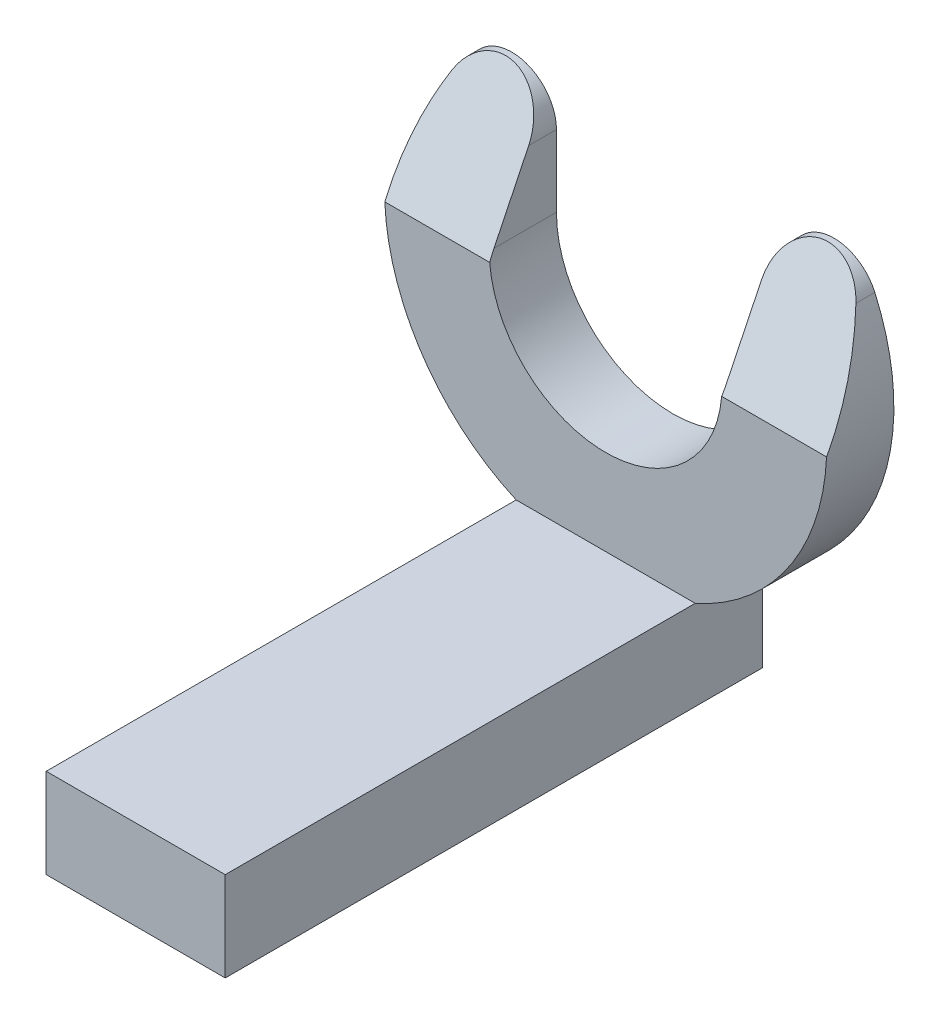
ISO-10303-21;
HEADER;
FILE_DESCRIPTION(('STEP AP214'),'2;1');
FILE_NAME('part.step','',(''),(''),'','','');
FILE_SCHEMA(('AUTOMOTIVE_DESIGN { 1 0 10303 214 1 1 1 1 }'));
ENDSEC;
DATA;
#1=APPLICATION_CONTEXT('core data for automotive mechanical design processes');
#2=APPLICATION_PROTOCOL_DEFINITION('international standard','automotive_design',2000,#1);
#3=PRODUCT_CONTEXT('',#1,'mechanical');
#4=PRODUCT('Part','Part','',(#3));
#5=PRODUCT_RELATED_PRODUCT_CATEGORY('part','',(#4));
#6=PRODUCT_DEFINITION_FORMATION('','',#4);
#7=PRODUCT_DEFINITION_CONTEXT('part definition',#1,'design');
#8=PRODUCT_DEFINITION('design','',#6,#7);
#9=PRODUCT_DEFINITION_SHAPE('','',#8);
#10=(LENGTH_UNIT() NAMED_UNIT(*) SI_UNIT(.MILLI.,.METRE.));
#11=(NAMED_UNIT(*) PLANE_ANGLE_UNIT() SI_UNIT($,.RADIAN.));
#12=(NAMED_UNIT(*) SI_UNIT($,.STERADIAN.) SOLID_ANGLE_UNIT());
#13=UNCERTAINTY_MEASURE_WITH_UNIT(LENGTH_MEASURE(1.E-05),#10,'distance_accuracy_value','');
#14=(GEOMETRIC_REPRESENTATION_CONTEXT(3) GLOBAL_UNCERTAINTY_ASSIGNED_CONTEXT((#13)) GLOBAL_UNIT_ASSIGNED_CONTEXT((#10,
#11,#12)) REPRESENTATION_CONTEXT('',''));
#15=CARTESIAN_POINT('',(0.,0.,0.));
#16=DIRECTION('',(0.,0.,1.));
#17=DIRECTION('',(1.,0.,0.));
#18=AXIS2_PLACEMENT_3D('',#15,#16,#17);
#19=CARTESIAN_POINT('',(-2.,2.,12.));
#20=DIRECTION('',(0.,-1.,0.));
#21=DIRECTION('',(0.,0.,-1.));
#22=AXIS2_PLACEMENT_3D('',#19,#20,#21);
#23=PLANE('',#22);
#24=DIRECTION('',(1.,0.,0.));
#25=VECTOR('',#24,1.);
#26=CARTESIAN_POINT('',(-2.,2.,1.5));
#27=LINE('',#26,#25);
#28=CARTESIAN_POINT('',(-2.,2.,1.5));
#29=VERTEX_POINT('',#28);
#30=CARTESIAN_POINT('',(2.,2.,1.5));
#31=VERTEX_POINT('',#30);
#32=EDGE_CURVE('E40',#29,#31,#27,.T.);
#33=ORIENTED_EDGE('',*,*,#32,.F.);
#34=DIRECTION('',(0.,0.,-1.));
#35=VECTOR('',#34,1.);
#36=CARTESIAN_POINT('',(-2.,2.,12.));
#37=LINE('',#36,#35);
#38=CARTESIAN_POINT('',(-2.,2.,12.));
#39=VERTEX_POINT('',#38);
#40=EDGE_CURVE('E204',#39,#29,#37,.T.);
#41=ORIENTED_EDGE('',*,*,#40,.F.);
#42=DIRECTION('',(-1.,0.,0.));
#43=VECTOR('',#42,1.);
#44=CARTESIAN_POINT('',(-2.,2.,12.));
#45=LINE('',#44,#43);
#46=CARTESIAN_POINT('',(2.,2.,12.));
#47=VERTEX_POINT('',#46);
#48=EDGE_CURVE('E202',#47,#39,#45,.T.);
#49=ORIENTED_EDGE('',*,*,#48,.F.);
#50=DIRECTION('',(0.,0.,-1.));
#51=VECTOR('',#50,1.);
#52=CARTESIAN_POINT('',(2.,2.,12.));
#53=LINE('',#52,#51);
#54=EDGE_CURVE('E212',#47,#31,#53,.T.);
#55=ORIENTED_EDGE('',*,*,#54,.T.);
#56=EDGE_LOOP('',(#33,#41,#49,#55));
#57=FACE_BOUND('',#56,.T.);
#58=ADVANCED_FACE('F32',(#57),#23,.F.);
#59=CARTESIAN_POINT('',(-2.,0.,12.));
#60=DIRECTION('',(1.,0.,0.));
#61=DIRECTION('',(0.,0.,-1.));
#62=AXIS2_PLACEMENT_3D('',#59,#60,#61);
#63=PLANE('',#62);
#64=DIRECTION('',(0.,-1.,0.));
#65=VECTOR('',#64,1.);
#66=CARTESIAN_POINT('',(-2.,0.,0.));
#67=LINE('',#66,#65);
#68=CARTESIAN_POINT('',(-2.,2.,0.));
#69=VERTEX_POINT('',#68);
#70=CARTESIAN_POINT('',(-2.,0.,0.));
#71=VERTEX_POINT('',#70);
#72=EDGE_CURVE('E193',#69,#71,#67,.T.);
#73=ORIENTED_EDGE('',*,*,#72,.T.);
#74=DIRECTION('',(0.,0.,-1.));
#75=VECTOR('',#74,1.);
#76=CARTESIAN_POINT('',(-2.,0.,12.));
#77=LINE('',#76,#75);
#78=CARTESIAN_POINT('',(-2.,0.,12.));
#79=VERTEX_POINT('',#78);
#80=EDGE_CURVE('E218',#79,#71,#77,.T.);
#81=ORIENTED_EDGE('',*,*,#80,.F.);
#82=DIRECTION('',(0.,-1.,0.));
#83=VECTOR('',#82,1.);
#84=CARTESIAN_POINT('',(-2.,0.,12.));
#85=LINE('',#84,#83);
#86=EDGE_CURVE('E194',#39,#79,#85,.T.);
#87=ORIENTED_EDGE('',*,*,#86,.F.);
#88=ORIENTED_EDGE('',*,*,#40,.T.);
#89=DIRECTION('',(0.,0.,-1.));
#90=VECTOR('',#89,1.);
#91=CARTESIAN_POINT('',(-2.,2.,1.5));
#92=LINE('',#91,#90);
#93=EDGE_CURVE('E151',#29,#69,#92,.T.);
#94=ORIENTED_EDGE('',*,*,#93,.T.);
#95=EDGE_LOOP('',(#73,#81,#87,#88,#94));
#96=FACE_BOUND('',#95,.T.);
#97=ADVANCED_FACE('F34',(#96),#63,.F.);
#98=CARTESIAN_POINT('',(-2.,0.,12.));
#99=DIRECTION('',(0.,1.,0.));
#100=DIRECTION('',(0.,0.,1.));
#101=AXIS2_PLACEMENT_3D('',#98,#99,#100);
#102=PLANE('',#101);
#103=DIRECTION('',(1.,0.,0.));
#104=VECTOR('',#103,1.);
#105=CARTESIAN_POINT('',(-2.,0.,0.));
#106=LINE('',#105,#104);
#107=CARTESIAN_POINT('',(2.,0.,0.));
#108=VERTEX_POINT('',#107);
#109=EDGE_CURVE('E207',#71,#108,#106,.T.);
#110=ORIENTED_EDGE('',*,*,#109,.T.);
#111=DIRECTION('',(0.,0.,-1.));
#112=VECTOR('',#111,1.);
#113=CARTESIAN_POINT('',(2.,0.,12.));
#114=LINE('',#113,#112);
#115=CARTESIAN_POINT('',(2.,0.,12.));
#116=VERTEX_POINT('',#115);
#117=EDGE_CURVE('E215',#116,#108,#114,.T.);
#118=ORIENTED_EDGE('',*,*,#117,.F.);
#119=DIRECTION('',(1.,0.,0.));
#120=VECTOR('',#119,1.);
#121=CARTESIAN_POINT('',(-2.,0.,12.));
#122=LINE('',#121,#120);
#123=EDGE_CURVE('E197',#79,#116,#122,.T.);
#124=ORIENTED_EDGE('',*,*,#123,.F.);
#125=ORIENTED_EDGE('',*,*,#80,.T.);
#126=EDGE_LOOP('',(#110,#118,#124,#125));
#127=FACE_BOUND('',#126,.T.);
#128=ADVANCED_FACE('F268',(#127),#102,.F.);
#129=CARTESIAN_POINT('',(2.,0.,12.));
#130=DIRECTION('',(-1.,0.,0.));
#131=DIRECTION('',(0.,0.,1.));
#132=AXIS2_PLACEMENT_3D('',#129,#130,#131);
#133=PLANE('',#132);
#134=DIRECTION('',(0.,1.,0.));
#135=VECTOR('',#134,1.);
#136=CARTESIAN_POINT('',(2.,0.,0.));
#137=LINE('',#136,#135);
#138=CARTESIAN_POINT('',(2.,2.,0.));
#139=VERTEX_POINT('',#138);
#140=EDGE_CURVE('E198',#108,#139,#137,.T.);
#141=ORIENTED_EDGE('',*,*,#140,.T.);
#142=DIRECTION('',(0.,0.,-1.));
#143=VECTOR('',#142,1.);
#144=CARTESIAN_POINT('',(2.,2.,1.5));
#145=LINE('',#144,#143);
#146=EDGE_CURVE('E180',#139,#31,#145,.F.);
#147=ORIENTED_EDGE('',*,*,#146,.T.);
#148=ORIENTED_EDGE('',*,*,#54,.F.);
#149=DIRECTION('',(0.,1.,0.));
#150=VECTOR('',#149,1.);
#151=CARTESIAN_POINT('',(2.,0.,12.));
#152=LINE('',#151,#150);
#153=EDGE_CURVE('E200',#116,#47,#152,.T.);
#154=ORIENTED_EDGE('',*,*,#153,.F.);
#155=ORIENTED_EDGE('',*,*,#117,.T.);
#156=EDGE_LOOP('',(#141,#147,#148,#154,#155));
#157=FACE_BOUND('',#156,.T.);
#158=ADVANCED_FACE('F232',(#157),#133,.F.);
#159=CARTESIAN_POINT('',(0.,0.,12.));
#160=DIRECTION('',(0.,0.,-1.));
#161=DIRECTION('',(-1.,0.,0.));
#162=AXIS2_PLACEMENT_3D('',#159,#160,#161);
#163=PLANE('',#162);
#164=ORIENTED_EDGE('',*,*,#86,.T.);
#165=ORIENTED_EDGE('',*,*,#123,.T.);
#166=ORIENTED_EDGE('',*,*,#153,.T.);
#167=ORIENTED_EDGE('',*,*,#48,.T.);
#168=EDGE_LOOP('',(#164,#165,#166,#167));
#169=FACE_BOUND('',#168,.T.);
#170=ADVANCED_FACE('F228',(#169),#163,.F.);
#171=CARTESIAN_POINT('',(0.,0.,0.));
#172=DIRECTION('',(0.,0.,-1.));
#173=DIRECTION('',(-1.,0.,0.));
#174=AXIS2_PLACEMENT_3D('',#171,#172,#173);
#175=PLANE('',#174);
#176=ORIENTED_EDGE('',*,*,#72,.F.);
#177=CARTESIAN_POINT('',(0.,6.51654775221352,0.));
#178=DIRECTION('',(0.,0.,-1.));
#179=DIRECTION('',(-1.,0.,0.));
#180=AXIS2_PLACEMENT_3D('',#177,#178,#179);
#181=CIRCLE('',#180,4.939555);
#182=CARTESIAN_POINT('',(-4.51380879312511,8.52272166718984,0.));
#183=VERTEX_POINT('',#182);
#184=EDGE_CURVE('E175',#69,#183,#181,.T.);
#185=ORIENTED_EDGE('',*,*,#184,.T.);
#186=CARTESIAN_POINT('',(-3.6,8.11657700132899,0.));
#187=DIRECTION('',(0.,0.,-1.));
#188=DIRECTION('',(-1.,0.,0.));
#189=AXIS2_PLACEMENT_3D('',#186,#187,#188);
#190=CIRCLE('',#189,1.);
#191=CARTESIAN_POINT('',(-2.6,8.11657700132899,0.));
#192=VERTEX_POINT('',#191);
#193=EDGE_CURVE('E159',#183,#192,#190,.T.);
#194=ORIENTED_EDGE('',*,*,#193,.T.);
#195=DIRECTION('',(0.,-1.,0.));
#196=VECTOR('',#195,1.);
#197=CARTESIAN_POINT('',(-2.6,6.51654775221352,0.));
#198=LINE('',#197,#196);
#199=CARTESIAN_POINT('',(-2.6,6.51654775221352,0.));
#200=VERTEX_POINT('',#199);
#201=EDGE_CURVE('E162',#192,#200,#198,.T.);
#202=ORIENTED_EDGE('',*,*,#201,.T.);
#203=CARTESIAN_POINT('',(0.,6.51654775221352,0.));
#204=DIRECTION('',(0.,0.,1.));
#205=DIRECTION('',(-1.,0.,0.));
#206=AXIS2_PLACEMENT_3D('',#203,#204,#205);
#207=CIRCLE('',#206,2.6);
#208=CARTESIAN_POINT('',(2.6,6.51654775221352,0.));
#209=VERTEX_POINT('',#208);
#210=EDGE_CURVE('E166',#200,#209,#207,.T.);
#211=ORIENTED_EDGE('',*,*,#210,.T.);
#212=DIRECTION('',(0.,1.,0.));
#213=VECTOR('',#212,1.);
#214=CARTESIAN_POINT('',(2.6,6.51654775221352,0.));
#215=LINE('',#214,#213);
#216=CARTESIAN_POINT('',(2.6,8.11657700132899,0.));
#217=VERTEX_POINT('',#216);
#218=EDGE_CURVE('E169',#209,#217,#215,.T.);
#219=ORIENTED_EDGE('',*,*,#218,.T.);
#220=CARTESIAN_POINT('',(3.6,8.11657700132899,0.));
#221=DIRECTION('',(0.,0.,-1.));
#222=DIRECTION('',(-1.,0.,0.));
#223=AXIS2_PLACEMENT_3D('',#220,#221,#222);
#224=CIRCLE('',#223,1.);
#225=CARTESIAN_POINT('',(4.51380879312511,8.52272166718984,0.));
#226=VERTEX_POINT('',#225);
#227=EDGE_CURVE('E172',#217,#226,#224,.T.);
#228=ORIENTED_EDGE('',*,*,#227,.T.);
#229=EDGE_CURVE('E155',#226,#139,#181,.T.);
#230=ORIENTED_EDGE('',*,*,#229,.T.);
#231=ORIENTED_EDGE('',*,*,#140,.F.);
#232=ORIENTED_EDGE('',*,*,#109,.F.);
#233=EDGE_LOOP('',(#176,#185,#194,#202,#211,#219,#228,#230,#231,#232));
#234=FACE_BOUND('',#233,.T.);
#235=ADVANCED_FACE('F241',(#234),#175,.T.);
#236=CARTESIAN_POINT('',(-3.6,8.11657700132899,1.5));
#237=DIRECTION('',(0.,0.,-1.));
#238=DIRECTION('',(-1.,0.,0.));
#239=AXIS2_PLACEMENT_3D('',#236,#237,#238);
#240=PLANE('',#239);
#241=CARTESIAN_POINT('',(0.,6.51654775221352,1.5));
#242=DIRECTION('',(0.,0.,-1.));
#243=DIRECTION('',(-1.,0.,0.));
#244=AXIS2_PLACEMENT_3D('',#241,#242,#243);
#245=CIRCLE('',#244,4.939555);
#246=CARTESIAN_POINT('',(4.93480604168353,6.3,1.5));
#247=VERTEX_POINT('',#246);
#248=EDGE_CURVE('E152',#247,#31,#245,.T.);
#249=ORIENTED_EDGE('',*,*,#248,.F.);
#250=DIRECTION('',(1.,0.,0.));
#251=VECTOR('',#250,1.);
#252=CARTESIAN_POINT('',(-4.939555,6.3,1.5));
#253=LINE('',#252,#251);
#254=CARTESIAN_POINT('',(2.59096643571685,6.3,1.5));
#255=VERTEX_POINT('',#254);
#256=EDGE_CURVE('E145',#255,#247,#253,.T.);
#257=ORIENTED_EDGE('',*,*,#256,.F.);
#258=CARTESIAN_POINT('',(0.,6.51654775221352,1.5));
#259=DIRECTION('',(0.,0.,1.));
#260=DIRECTION('',(-1.,0.,0.));
#261=AXIS2_PLACEMENT_3D('',#258,#259,#260);
#262=CIRCLE('',#261,2.6);
#263=CARTESIAN_POINT('',(-2.59096643571685,6.3,1.5));
#264=VERTEX_POINT('',#263);
#265=EDGE_CURVE('E144',#264,#255,#262,.T.);
#266=ORIENTED_EDGE('',*,*,#265,.F.);
#267=CARTESIAN_POINT('',(-4.93480604168353,6.3,1.5));
#268=VERTEX_POINT('',#267);
#269=EDGE_CURVE('E127',#268,#264,#253,.T.);
#270=ORIENTED_EDGE('',*,*,#269,.F.);
#271=EDGE_CURVE('E141',#29,#268,#245,.T.);
#272=ORIENTED_EDGE('',*,*,#271,.F.);
#273=ORIENTED_EDGE('',*,*,#32,.T.);
#274=EDGE_LOOP('',(#249,#257,#266,#270,#272,#273));
#275=FACE_BOUND('',#274,.T.);
#276=ADVANCED_FACE('F139',(#275),#240,.F.);
#277=CARTESIAN_POINT('',(0.,6.51654775221352,1.5));
#278=DIRECTION('',(0.,0.,-1.));
#279=DIRECTION('',(-1.,0.,0.));
#280=AXIS2_PLACEMENT_3D('',#277,#278,#279);
#281=CYLINDRICAL_SURFACE('',#280,4.939555);
#282=CARTESIAN_POINT('',(0.,6.51654775221352,1.39507888960561));
#283=DIRECTION('',(0.,-0.436032101812273,-0.899931111913113));
#284=DIRECTION('',(0.,0.899931111913113,-0.436032101812273));
#285=AXIS2_PLACEMENT_3D('',#282,#283,#284);
#286=ELLIPSE('',#285,5.48881457103898,4.939555);
#287=CARTESIAN_POINT('',(-4.51380879312511,8.52272166718984,0.423053123223904));
#288=VERTEX_POINT('',#287);
#289=EDGE_CURVE('E124',#288,#268,#286,.F.);
#290=ORIENTED_EDGE('',*,*,#289,.F.);
#291=DIRECTION('',(0.,0.,-1.));
#292=VECTOR('',#291,1.);
#293=CARTESIAN_POINT('',(-4.51380879312511,8.52272166718984,1.5));
#294=LINE('',#293,#292);
#295=EDGE_CURVE('E178',#288,#183,#294,.T.);
#296=ORIENTED_EDGE('',*,*,#295,.T.);
#297=ORIENTED_EDGE('',*,*,#184,.F.);
#298=ORIENTED_EDGE('',*,*,#93,.F.);
#299=ORIENTED_EDGE('',*,*,#271,.T.);
#300=EDGE_LOOP('',(#290,#296,#297,#298,#299));
#301=FACE_BOUND('',#300,.T.);
#302=ADVANCED_FACE('F148',(#301),#281,.T.);
#303=CARTESIAN_POINT('',(0.,6.51654775221352,1.39507888960561));
#304=DIRECTION('',(0.,-0.436032101812273,-0.899931111913113));
#305=DIRECTION('',(0.,0.899931111913113,-0.436032101812273));
#306=AXIS2_PLACEMENT_3D('',#303,#304,#305);
#307=ELLIPSE('',#306,5.48881457103898,4.939555);
#308=CARTESIAN_POINT('',(4.51380879312511,8.52272166718984,0.423053123223904));
#309=VERTEX_POINT('',#308);
#310=EDGE_CURVE('E163',#247,#309,#307,.F.);
#311=ORIENTED_EDGE('',*,*,#310,.F.);
#312=ORIENTED_EDGE('',*,*,#248,.T.);
#313=ORIENTED_EDGE('',*,*,#146,.F.);
#314=ORIENTED_EDGE('',*,*,#229,.F.);
#315=DIRECTION('',(0.,0.,-1.));
#316=VECTOR('',#315,1.);
#317=CARTESIAN_POINT('',(4.51380879312511,8.52272166718984,1.5));
#318=LINE('',#317,#316);
#319=EDGE_CURVE('E181',#309,#226,#318,.T.);
#320=ORIENTED_EDGE('',*,*,#319,.F.);
#321=EDGE_LOOP('',(#311,#312,#313,#314,#320));
#322=FACE_BOUND('',#321,.T.);
#323=ADVANCED_FACE('F238',(#322),#281,.T.);
#324=CARTESIAN_POINT('',(-3.6,8.11657700132899,1.5));
#325=DIRECTION('',(0.,0.,-1.));
#326=DIRECTION('',(-1.,0.,0.));
#327=AXIS2_PLACEMENT_3D('',#324,#325,#326);
#328=CYLINDRICAL_SURFACE('',#327,1.);
#329=ORIENTED_EDGE('',*,*,#295,.F.);
#330=CARTESIAN_POINT('',(-3.6,8.11657700132899,0.619837199194655));
#331=DIRECTION('',(0.,-0.436032101812273,-0.899931111913113));
#332=DIRECTION('',(0.,0.899931111913113,-0.436032101812273));
#333=AXIS2_PLACEMENT_3D('',#330,#331,#332);
#334=ELLIPSE('',#333,1.11119616464215,1.);
#335=CARTESIAN_POINT('',(-2.6,8.11657700132899,0.619837199194655));
#336=VERTEX_POINT('',#335);
#337=EDGE_CURVE('E129',#336,#288,#334,.F.);
#338=ORIENTED_EDGE('',*,*,#337,.F.);
#339=DIRECTION('',(0.,0.,-1.));
#340=VECTOR('',#339,1.);
#341=CARTESIAN_POINT('',(-2.6,8.11657700132899,1.5));
#342=LINE('',#341,#340);
#343=EDGE_CURVE('E154',#336,#192,#342,.T.);
#344=ORIENTED_EDGE('',*,*,#343,.T.);
#345=ORIENTED_EDGE('',*,*,#193,.F.);
#346=EDGE_LOOP('',(#329,#338,#344,#345));
#347=FACE_BOUND('',#346,.T.);
#348=ADVANCED_FACE('F264',(#347),#328,.T.);
#349=CARTESIAN_POINT('',(3.6,8.11657700132899,1.5));
#350=DIRECTION('',(0.,0.,-1.));
#351=DIRECTION('',(-1.,0.,0.));
#352=AXIS2_PLACEMENT_3D('',#349,#350,#351);
#353=CYLINDRICAL_SURFACE('',#352,1.);
#354=DIRECTION('',(0.,0.,-1.));
#355=VECTOR('',#354,1.);
#356=CARTESIAN_POINT('',(2.6,8.11657700132899,1.5));
#357=LINE('',#356,#355);
#358=CARTESIAN_POINT('',(2.6,8.11657700132899,0.619837199194655));
#359=VERTEX_POINT('',#358);
#360=EDGE_CURVE('E183',#359,#217,#357,.T.);
#361=ORIENTED_EDGE('',*,*,#360,.F.);
#362=CARTESIAN_POINT('',(3.6,8.11657700132899,0.619837199194655));
#363=DIRECTION('',(0.,-0.436032101812273,-0.899931111913113));
#364=DIRECTION('',(0.,0.899931111913113,-0.436032101812273));
#365=AXIS2_PLACEMENT_3D('',#362,#363,#364);
#366=ELLIPSE('',#365,1.11119616464215,1.);
#367=EDGE_CURVE('E248',#309,#359,#366,.F.);
#368=ORIENTED_EDGE('',*,*,#367,.F.);
#369=ORIENTED_EDGE('',*,*,#319,.T.);
#370=ORIENTED_EDGE('',*,*,#227,.F.);
#371=EDGE_LOOP('',(#361,#368,#369,#370));
#372=FACE_BOUND('',#371,.T.);
#373=ADVANCED_FACE('F246',(#372),#353,.T.);
#374=CARTESIAN_POINT('',(2.6,6.51654775221352,1.5));
#375=DIRECTION('',(-1.,0.,0.));
#376=DIRECTION('',(0.,0.,1.));
#377=AXIS2_PLACEMENT_3D('',#374,#375,#376);
#378=PLANE('',#377);
#379=DIRECTION('',(0.,-0.899931111913113,0.436032101812273));
#380=VECTOR('',#379,1.);
#381=CARTESIAN_POINT('',(2.6,6.47537682871193,1.41502691014886));
#382=LINE('',#381,#380);
#383=CARTESIAN_POINT('',(2.6,6.51654775221352,1.39507888960561));
#384=VERTEX_POINT('',#383);
#385=EDGE_CURVE('E47',#359,#384,#382,.T.);
#386=ORIENTED_EDGE('',*,*,#385,.F.);
#387=ORIENTED_EDGE('',*,*,#360,.T.);
#388=ORIENTED_EDGE('',*,*,#218,.F.);
#389=DIRECTION('',(0.,0.,-1.));
#390=VECTOR('',#389,1.);
#391=CARTESIAN_POINT('',(2.6,6.51654775221352,1.5));
#392=LINE('',#391,#390);
#393=EDGE_CURVE('E185',#384,#209,#392,.T.);
#394=ORIENTED_EDGE('',*,*,#393,.F.);
#395=EDGE_LOOP('',(#386,#387,#388,#394));
#396=FACE_BOUND('',#395,.T.);
#397=ADVANCED_FACE('F290',(#396),#378,.T.);
#398=CARTESIAN_POINT('',(0.,6.51654775221352,1.5));
#399=DIRECTION('',(0.,0.,-1.));
#400=DIRECTION('',(-1.,0.,0.));
#401=AXIS2_PLACEMENT_3D('',#398,#399,#400);
#402=CYLINDRICAL_SURFACE('',#401,2.6);
#403=CARTESIAN_POINT('',(0.,6.51654775221352,1.39507888960561));
#404=DIRECTION('',(0.,-0.436032101812273,-0.899931111913113));
#405=DIRECTION('',(0.,0.899931111913113,-0.436032101812273));
#406=AXIS2_PLACEMENT_3D('',#403,#404,#405);
#407=ELLIPSE('',#406,2.8891100280696,2.6);
#408=EDGE_CURVE('E133',#384,#255,#407,.T.);
#409=ORIENTED_EDGE('',*,*,#408,.F.);
#410=ORIENTED_EDGE('',*,*,#393,.T.);
#411=ORIENTED_EDGE('',*,*,#210,.F.);
#412=DIRECTION('',(0.,0.,-1.));
#413=VECTOR('',#412,1.);
#414=CARTESIAN_POINT('',(-2.6,6.51654775221352,1.5));
#415=LINE('',#414,#413);
#416=CARTESIAN_POINT('',(-2.6,6.51654775221352,1.39507888960561));
#417=VERTEX_POINT('',#416);
#418=EDGE_CURVE('E187',#417,#200,#415,.T.);
#419=ORIENTED_EDGE('',*,*,#418,.F.);
#420=EDGE_CURVE('E54',#264,#417,#407,.T.);
#421=ORIENTED_EDGE('',*,*,#420,.F.);
#422=ORIENTED_EDGE('',*,*,#265,.T.);
#423=EDGE_LOOP('',(#409,#410,#411,#419,#421,#422));
#424=FACE_BOUND('',#423,.T.);
#425=ADVANCED_FACE('F255',(#424),#402,.F.);
#426=CARTESIAN_POINT('',(-2.6,6.51654775221352,1.5));
#427=DIRECTION('',(1.,0.,0.));
#428=DIRECTION('',(0.,0.,-1.));
#429=AXIS2_PLACEMENT_3D('',#426,#427,#428);
#430=PLANE('',#429);
#431=DIRECTION('',(0.,0.899931111913113,-0.436032101812273));
#432=VECTOR('',#431,1.);
#433=CARTESIAN_POINT('',(-2.6,6.47537682871193,1.41502691014886));
#434=LINE('',#433,#432);
#435=EDGE_CURVE('E11',#417,#336,#434,.T.);
#436=ORIENTED_EDGE('',*,*,#435,.F.);
#437=ORIENTED_EDGE('',*,*,#418,.T.);
#438=ORIENTED_EDGE('',*,*,#201,.F.);
#439=ORIENTED_EDGE('',*,*,#343,.F.);
#440=EDGE_LOOP('',(#436,#437,#438,#439));
#441=FACE_BOUND('',#440,.T.);
#442=ADVANCED_FACE('F261',(#441),#430,.T.);
#443=CARTESIAN_POINT('',(-4.939555,9.11657700132899,0.13532));
#444=DIRECTION('',(0.,-0.436032101812273,-0.899931111913113));
#445=DIRECTION('',(0.,0.899931111913113,-0.436032101812273));
#446=AXIS2_PLACEMENT_3D('',#443,#444,#445);
#447=PLANE('',#446);
#448=ORIENTED_EDGE('',*,*,#289,.T.);
#449=ORIENTED_EDGE('',*,*,#269,.T.);
#450=ORIENTED_EDGE('',*,*,#420,.T.);
#451=ORIENTED_EDGE('',*,*,#435,.T.);
#452=ORIENTED_EDGE('',*,*,#337,.T.);
#453=EDGE_LOOP('',(#448,#449,#450,#451,#452));
#454=FACE_BOUND('',#453,.T.);
#455=ADVANCED_FACE('F126',(#454),#447,.F.);
#456=ORIENTED_EDGE('',*,*,#310,.T.);
#457=ORIENTED_EDGE('',*,*,#367,.T.);
#458=ORIENTED_EDGE('',*,*,#385,.T.);
#459=ORIENTED_EDGE('',*,*,#408,.T.);
#460=ORIENTED_EDGE('',*,*,#256,.T.);
#461=EDGE_LOOP('',(#456,#457,#458,#459,#460));
#462=FACE_BOUND('',#461,.T.);
#463=ADVANCED_FACE('F253',(#462),#447,.F.);
#464=CLOSED_SHELL('',(#58,#97,#128,#158,#170,#235,#276,#302,#323,#348,#373,#397,#425,#442,#455,#463));
#465=MANIFOLD_SOLID_BREP('B2',#464);
#466=ADVANCED_BREP_SHAPE_REPRESENTATION('',(#18,#465),#14);
#467=SHAPE_DEFINITION_REPRESENTATION(#9,#466);
ENDSEC;
END-ISO-10303-21;
